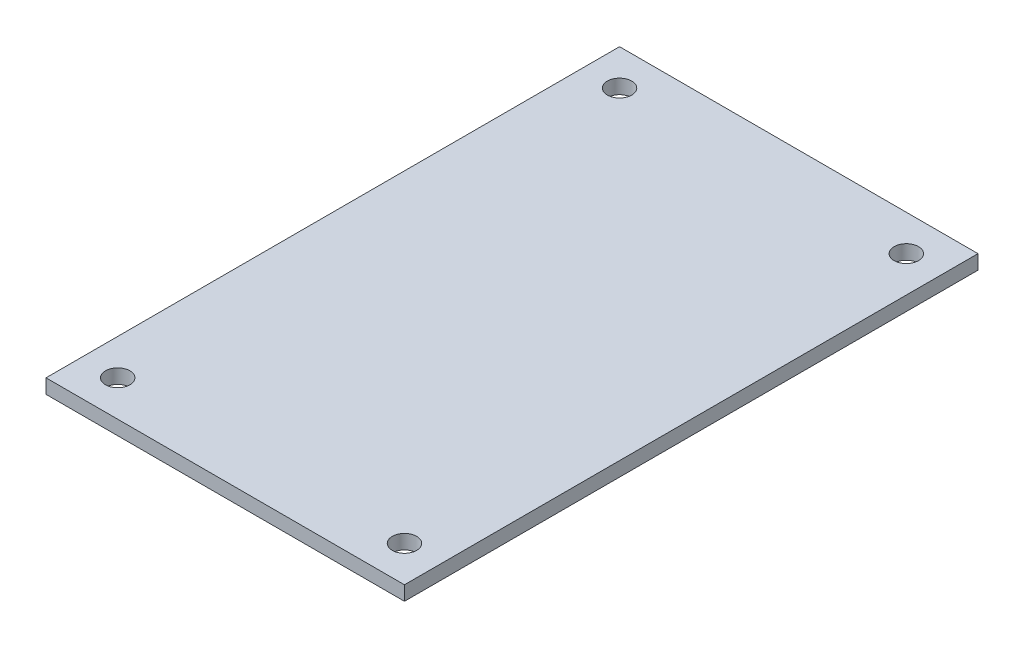
ISO-10303-21;
HEADER;
FILE_DESCRIPTION(('STEP AP214'),'2;1');
FILE_NAME('part.step','',(''),(''),'','','');
FILE_SCHEMA(('AUTOMOTIVE_DESIGN { 1 0 10303 214 1 1 1 1 }'));
ENDSEC;
DATA;
#1=APPLICATION_CONTEXT('core data for automotive mechanical design processes');
#2=APPLICATION_PROTOCOL_DEFINITION('international standard','automotive_design',2000,#1);
#3=PRODUCT_CONTEXT('',#1,'mechanical');
#4=PRODUCT('Part','Part','',(#3));
#5=PRODUCT_RELATED_PRODUCT_CATEGORY('part','',(#4));
#6=PRODUCT_DEFINITION_FORMATION('','',#4);
#7=PRODUCT_DEFINITION_CONTEXT('part definition',#1,'design');
#8=PRODUCT_DEFINITION('design','',#6,#7);
#9=PRODUCT_DEFINITION_SHAPE('','',#8);
#10=(LENGTH_UNIT() NAMED_UNIT(*) SI_UNIT(.MILLI.,.METRE.));
#11=(NAMED_UNIT(*) PLANE_ANGLE_UNIT() SI_UNIT($,.RADIAN.));
#12=(NAMED_UNIT(*) SI_UNIT($,.STERADIAN.) SOLID_ANGLE_UNIT());
#13=UNCERTAINTY_MEASURE_WITH_UNIT(LENGTH_MEASURE(1.E-05),#10,'distance_accuracy_value','');
#14=(GEOMETRIC_REPRESENTATION_CONTEXT(3) GLOBAL_UNCERTAINTY_ASSIGNED_CONTEXT((#13)) GLOBAL_UNIT_ASSIGNED_CONTEXT((#10,
#11,#12)) REPRESENTATION_CONTEXT('',''));
#15=CARTESIAN_POINT('',(0.,0.,0.));
#16=DIRECTION('',(0.,0.,1.));
#17=DIRECTION('',(1.,0.,0.));
#18=AXIS2_PLACEMENT_3D('',#15,#16,#17);
#19=CARTESIAN_POINT('',(0.,0.,80.));
#20=DIRECTION('',(0.,0.,1.));
#21=DIRECTION('',(1.,0.,0.));
#22=AXIS2_PLACEMENT_3D('',#19,#20,#21);
#23=PLANE('',#22);
#24=DIRECTION('',(-1.,0.,0.));
#25=VECTOR('',#24,1.);
#26=CARTESIAN_POINT('',(0.,-1.,80.));
#27=LINE('',#26,#25);
#28=CARTESIAN_POINT('',(25.,-1.,80.));
#29=VERTEX_POINT('',#28);
#30=CARTESIAN_POINT('',(-25.,-1.,80.));
#31=VERTEX_POINT('',#30);
#32=EDGE_CURVE('E11',#29,#31,#27,.T.);
#33=ORIENTED_EDGE('',*,*,#32,.F.);
#34=DIRECTION('',(0.,-1.,0.));
#35=VECTOR('',#34,1.);
#36=CARTESIAN_POINT('',(25.,0.,80.));
#37=LINE('',#36,#35);
#38=CARTESIAN_POINT('',(25.,1.,80.));
#39=VERTEX_POINT('',#38);
#40=EDGE_CURVE('E64',#39,#29,#37,.T.);
#41=ORIENTED_EDGE('',*,*,#40,.F.);
#42=DIRECTION('',(1.,0.,0.));
#43=VECTOR('',#42,1.);
#44=CARTESIAN_POINT('',(0.,1.,80.));
#45=LINE('',#44,#43);
#46=CARTESIAN_POINT('',(-25.,1.,80.));
#47=VERTEX_POINT('',#46);
#48=EDGE_CURVE('E103',#47,#39,#45,.T.);
#49=ORIENTED_EDGE('',*,*,#48,.F.);
#50=DIRECTION('',(0.,1.,0.));
#51=VECTOR('',#50,1.);
#52=CARTESIAN_POINT('',(-25.,0.,80.));
#53=LINE('',#52,#51);
#54=EDGE_CURVE('E26',#31,#47,#53,.T.);
#55=ORIENTED_EDGE('',*,*,#54,.F.);
#56=EDGE_LOOP('',(#33,#41,#49,#55));
#57=FACE_BOUND('',#56,.T.);
#58=ADVANCED_FACE('F17',(#57),#23,.T.);
#59=CARTESIAN_POINT('',(0.,-1.,0.));
#60=DIRECTION('',(0.,-1.,0.));
#61=DIRECTION('',(0.,0.,-1.));
#62=AXIS2_PLACEMENT_3D('',#59,#60,#61);
#63=PLANE('',#62);
#64=CARTESIAN_POINT('',(20.,-1.,75.));
#65=DIRECTION('',(0.,-1.,0.));
#66=DIRECTION('',(0.,0.,-1.));
#67=AXIS2_PLACEMENT_3D('',#64,#65,#66);
#68=CIRCLE('',#67,1.7);
#69=CARTESIAN_POINT('',(20.,-1.,73.3));
#70=VERTEX_POINT('',#69);
#71=EDGE_CURVE('E119',#70,#70,#68,.T.);
#72=ORIENTED_EDGE('',*,*,#71,.F.);
#73=EDGE_LOOP('',(#72));
#74=FACE_BOUND('',#73,.T.);
#75=CARTESIAN_POINT('',(20.,-1.,5.));
#76=DIRECTION('',(0.,-1.,0.));
#77=DIRECTION('',(0.,0.,-1.));
#78=AXIS2_PLACEMENT_3D('',#75,#76,#77);
#79=CIRCLE('',#78,1.7);
#80=CARTESIAN_POINT('',(20.,-1.,3.3));
#81=VERTEX_POINT('',#80);
#82=EDGE_CURVE('E115',#81,#81,#79,.T.);
#83=ORIENTED_EDGE('',*,*,#82,.F.);
#84=EDGE_LOOP('',(#83));
#85=FACE_BOUND('',#84,.T.);
#86=CARTESIAN_POINT('',(-20.,-1.,75.));
#87=DIRECTION('',(0.,-1.,0.));
#88=DIRECTION('',(0.,0.,-1.));
#89=AXIS2_PLACEMENT_3D('',#86,#87,#88);
#90=CIRCLE('',#89,1.7);
#91=CARTESIAN_POINT('',(-20.,-1.,73.3));
#92=VERTEX_POINT('',#91);
#93=EDGE_CURVE('E111',#92,#92,#90,.T.);
#94=ORIENTED_EDGE('',*,*,#93,.F.);
#95=EDGE_LOOP('',(#94));
#96=FACE_BOUND('',#95,.T.);
#97=CARTESIAN_POINT('',(-20.,-1.,5.));
#98=DIRECTION('',(0.,-1.,0.));
#99=DIRECTION('',(0.,0.,-1.));
#100=AXIS2_PLACEMENT_3D('',#97,#98,#99);
#101=CIRCLE('',#100,1.7);
#102=CARTESIAN_POINT('',(-20.,-1.,3.3));
#103=VERTEX_POINT('',#102);
#104=EDGE_CURVE('E77',#103,#103,#101,.T.);
#105=ORIENTED_EDGE('',*,*,#104,.F.);
#106=EDGE_LOOP('',(#105));
#107=FACE_BOUND('',#106,.T.);
#108=DIRECTION('',(0.,0.,1.));
#109=VECTOR('',#108,1.);
#110=CARTESIAN_POINT('',(25.,-1.,0.));
#111=LINE('',#110,#109);
#112=CARTESIAN_POINT('',(25.,-1.,0.));
#113=VERTEX_POINT('',#112);
#114=EDGE_CURVE('E57',#113,#29,#111,.T.);
#115=ORIENTED_EDGE('',*,*,#114,.T.);
#116=ORIENTED_EDGE('',*,*,#32,.T.);
#117=DIRECTION('',(0.,0.,1.));
#118=VECTOR('',#117,1.);
#119=CARTESIAN_POINT('',(-25.,-1.,0.));
#120=LINE('',#119,#118);
#121=CARTESIAN_POINT('',(-25.,-1.,0.));
#122=VERTEX_POINT('',#121);
#123=EDGE_CURVE('E71',#122,#31,#120,.T.);
#124=ORIENTED_EDGE('',*,*,#123,.F.);
#125=DIRECTION('',(1.,0.,0.));
#126=VECTOR('',#125,1.);
#127=CARTESIAN_POINT('',(0.,-1.,0.));
#128=LINE('',#127,#126);
#129=EDGE_CURVE('E69',#122,#113,#128,.T.);
#130=ORIENTED_EDGE('',*,*,#129,.T.);
#131=EDGE_LOOP('',(#115,#116,#124,#130));
#132=FACE_BOUND('',#131,.T.);
#133=ADVANCED_FACE('F70',(#74,#85,#96,#107,#132),#63,.T.);
#134=CARTESIAN_POINT('',(-25.,0.,0.));
#135=DIRECTION('',(-1.,0.,0.));
#136=DIRECTION('',(0.,0.,1.));
#137=AXIS2_PLACEMENT_3D('',#134,#135,#136);
#138=PLANE('',#137);
#139=ORIENTED_EDGE('',*,*,#123,.T.);
#140=ORIENTED_EDGE('',*,*,#54,.T.);
#141=DIRECTION('',(0.,0.,1.));
#142=VECTOR('',#141,1.);
#143=CARTESIAN_POINT('',(-25.,1.,0.));
#144=LINE('',#143,#142);
#145=CARTESIAN_POINT('',(-25.,1.,0.));
#146=VERTEX_POINT('',#145);
#147=EDGE_CURVE('E95',#146,#47,#144,.T.);
#148=ORIENTED_EDGE('',*,*,#147,.F.);
#149=DIRECTION('',(0.,-1.,0.));
#150=VECTOR('',#149,1.);
#151=CARTESIAN_POINT('',(-25.,0.,0.));
#152=LINE('',#151,#150);
#153=EDGE_CURVE('E76',#146,#122,#152,.T.);
#154=ORIENTED_EDGE('',*,*,#153,.T.);
#155=EDGE_LOOP('',(#139,#140,#148,#154));
#156=FACE_BOUND('',#155,.T.);
#157=ADVANCED_FACE('F143',(#156),#138,.T.);
#158=CARTESIAN_POINT('',(0.,1.,0.));
#159=DIRECTION('',(0.,1.,0.));
#160=DIRECTION('',(0.,0.,1.));
#161=AXIS2_PLACEMENT_3D('',#158,#159,#160);
#162=PLANE('',#161);
#163=CARTESIAN_POINT('',(20.,1.,75.));
#164=DIRECTION('',(0.,1.,0.));
#165=DIRECTION('',(0.,0.,1.));
#166=AXIS2_PLACEMENT_3D('',#163,#164,#165);
#167=CIRCLE('',#166,1.7);
#168=CARTESIAN_POINT('',(20.,1.,76.7));
#169=VERTEX_POINT('',#168);
#170=EDGE_CURVE('E20',#169,#169,#167,.T.);
#171=ORIENTED_EDGE('',*,*,#170,.F.);
#172=EDGE_LOOP('',(#171));
#173=FACE_BOUND('',#172,.T.);
#174=CARTESIAN_POINT('',(20.,1.,5.));
#175=DIRECTION('',(0.,1.,0.));
#176=DIRECTION('',(0.,0.,1.));
#177=AXIS2_PLACEMENT_3D('',#174,#175,#176);
#178=CIRCLE('',#177,1.7);
#179=CARTESIAN_POINT('',(20.,1.,6.7));
#180=VERTEX_POINT('',#179);
#181=EDGE_CURVE('E116',#180,#180,#178,.T.);
#182=ORIENTED_EDGE('',*,*,#181,.F.);
#183=EDGE_LOOP('',(#182));
#184=FACE_BOUND('',#183,.T.);
#185=CARTESIAN_POINT('',(-20.,1.,75.));
#186=DIRECTION('',(0.,1.,0.));
#187=DIRECTION('',(0.,0.,1.));
#188=AXIS2_PLACEMENT_3D('',#185,#186,#187);
#189=CIRCLE('',#188,1.7);
#190=CARTESIAN_POINT('',(-20.,1.,76.7));
#191=VERTEX_POINT('',#190);
#192=EDGE_CURVE('E112',#191,#191,#189,.T.);
#193=ORIENTED_EDGE('',*,*,#192,.F.);
#194=EDGE_LOOP('',(#193));
#195=FACE_BOUND('',#194,.T.);
#196=CARTESIAN_POINT('',(-20.,1.,5.));
#197=DIRECTION('',(0.,1.,0.));
#198=DIRECTION('',(0.,0.,1.));
#199=AXIS2_PLACEMENT_3D('',#196,#197,#198);
#200=CIRCLE('',#199,1.7);
#201=CARTESIAN_POINT('',(-20.,1.,6.7));
#202=VERTEX_POINT('',#201);
#203=EDGE_CURVE('E107',#202,#202,#200,.T.);
#204=ORIENTED_EDGE('',*,*,#203,.F.);
#205=EDGE_LOOP('',(#204));
#206=FACE_BOUND('',#205,.T.);
#207=ORIENTED_EDGE('',*,*,#147,.T.);
#208=ORIENTED_EDGE('',*,*,#48,.T.);
#209=DIRECTION('',(0.,0.,1.));
#210=VECTOR('',#209,1.);
#211=CARTESIAN_POINT('',(25.,1.,0.));
#212=LINE('',#211,#210);
#213=CARTESIAN_POINT('',(25.,1.,0.));
#214=VERTEX_POINT('',#213);
#215=EDGE_CURVE('E66',#214,#39,#212,.T.);
#216=ORIENTED_EDGE('',*,*,#215,.F.);
#217=DIRECTION('',(-1.,0.,0.));
#218=VECTOR('',#217,1.);
#219=CARTESIAN_POINT('',(0.,1.,0.));
#220=LINE('',#219,#218);
#221=EDGE_CURVE('E82',#214,#146,#220,.T.);
#222=ORIENTED_EDGE('',*,*,#221,.T.);
#223=EDGE_LOOP('',(#207,#208,#216,#222));
#224=FACE_BOUND('',#223,.T.);
#225=ADVANCED_FACE('F149',(#173,#184,#195,#206,#224),#162,.T.);
#226=CARTESIAN_POINT('',(0.,0.,0.));
#227=DIRECTION('',(0.,0.,-1.));
#228=DIRECTION('',(-1.,0.,0.));
#229=AXIS2_PLACEMENT_3D('',#226,#227,#228);
#230=PLANE('',#229);
#231=DIRECTION('',(0.,1.,0.));
#232=VECTOR('',#231,1.);
#233=CARTESIAN_POINT('',(25.,0.,0.));
#234=LINE('',#233,#232);
#235=EDGE_CURVE('E62',#113,#214,#234,.T.);
#236=ORIENTED_EDGE('',*,*,#235,.F.);
#237=ORIENTED_EDGE('',*,*,#129,.F.);
#238=ORIENTED_EDGE('',*,*,#153,.F.);
#239=ORIENTED_EDGE('',*,*,#221,.F.);
#240=EDGE_LOOP('',(#236,#237,#238,#239));
#241=FACE_BOUND('',#240,.T.);
#242=ADVANCED_FACE('F80',(#241),#230,.T.);
#243=CARTESIAN_POINT('',(25.,0.,0.));
#244=DIRECTION('',(1.,0.,0.));
#245=DIRECTION('',(0.,0.,-1.));
#246=AXIS2_PLACEMENT_3D('',#243,#244,#245);
#247=PLANE('',#246);
#248=ORIENTED_EDGE('',*,*,#235,.T.);
#249=ORIENTED_EDGE('',*,*,#215,.T.);
#250=ORIENTED_EDGE('',*,*,#40,.T.);
#251=ORIENTED_EDGE('',*,*,#114,.F.);
#252=EDGE_LOOP('',(#248,#249,#250,#251));
#253=FACE_BOUND('',#252,.T.);
#254=ADVANCED_FACE('F59',(#253),#247,.T.);
#255=CARTESIAN_POINT('',(-20.,-1.3,5.));
#256=DIRECTION('',(0.,1.,0.));
#257=DIRECTION('',(0.,0.,1.));
#258=AXIS2_PLACEMENT_3D('',#255,#256,#257);
#259=CYLINDRICAL_SURFACE('',#258,1.7);
#260=ORIENTED_EDGE('',*,*,#104,.T.);
#261=EDGE_LOOP('',(#260));
#262=FACE_BOUND('',#261,.T.);
#263=ORIENTED_EDGE('',*,*,#203,.T.);
#264=EDGE_LOOP('',(#263));
#265=FACE_BOUND('',#264,.T.);
#266=ADVANCED_FACE('F139',(#262,#265),#259,.F.);
#267=CARTESIAN_POINT('',(-20.,-1.3,75.));
#268=DIRECTION('',(0.,1.,0.));
#269=DIRECTION('',(0.,0.,1.));
#270=AXIS2_PLACEMENT_3D('',#267,#268,#269);
#271=CYLINDRICAL_SURFACE('',#270,1.7);
#272=ORIENTED_EDGE('',*,*,#93,.T.);
#273=EDGE_LOOP('',(#272));
#274=FACE_BOUND('',#273,.T.);
#275=ORIENTED_EDGE('',*,*,#192,.T.);
#276=EDGE_LOOP('',(#275));
#277=FACE_BOUND('',#276,.T.);
#278=ADVANCED_FACE('F163',(#274,#277),#271,.F.);
#279=CARTESIAN_POINT('',(20.,-1.3,5.));
#280=DIRECTION('',(0.,1.,0.));
#281=DIRECTION('',(0.,0.,1.));
#282=AXIS2_PLACEMENT_3D('',#279,#280,#281);
#283=CYLINDRICAL_SURFACE('',#282,1.7);
#284=ORIENTED_EDGE('',*,*,#82,.T.);
#285=EDGE_LOOP('',(#284));
#286=FACE_BOUND('',#285,.T.);
#287=ORIENTED_EDGE('',*,*,#181,.T.);
#288=EDGE_LOOP('',(#287));
#289=FACE_BOUND('',#288,.T.);
#290=ADVANCED_FACE('F166',(#286,#289),#283,.F.);
#291=CARTESIAN_POINT('',(20.,-1.3,75.));
#292=DIRECTION('',(0.,1.,0.));
#293=DIRECTION('',(0.,0.,1.));
#294=AXIS2_PLACEMENT_3D('',#291,#292,#293);
#295=CYLINDRICAL_SURFACE('',#294,1.7);
#296=ORIENTED_EDGE('',*,*,#71,.T.);
#297=EDGE_LOOP('',(#296));
#298=FACE_BOUND('',#297,.T.);
#299=ORIENTED_EDGE('',*,*,#170,.T.);
#300=EDGE_LOOP('',(#299));
#301=FACE_BOUND('',#300,.T.);
#302=ADVANCED_FACE('F170',(#298,#301),#295,.F.);
#303=CLOSED_SHELL('',(#58,#133,#157,#225,#242,#254,#266,#278,#290,#302));
#304=MANIFOLD_SOLID_BREP('B1',#303);
#305=ADVANCED_BREP_SHAPE_REPRESENTATION('',(#18,#304),#14);
#306=SHAPE_DEFINITION_REPRESENTATION(#9,#305);
ENDSEC;
END-ISO-10303-21;
